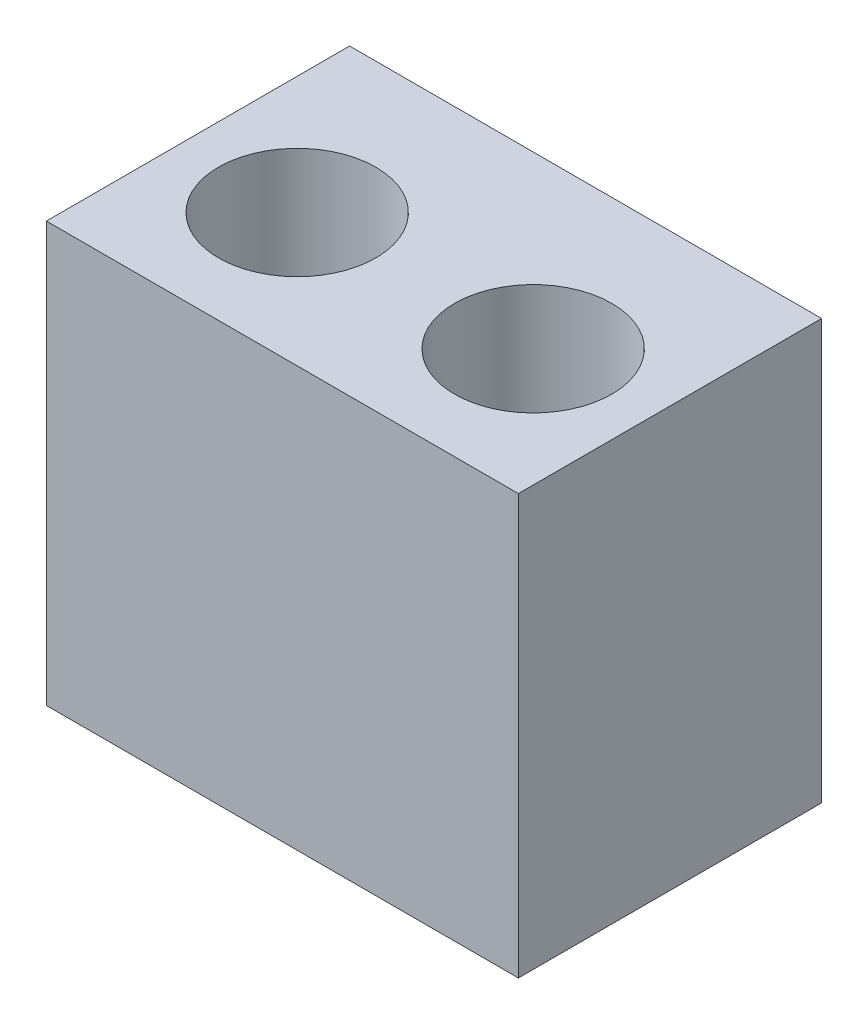
ISO-10303-21;
HEADER;
FILE_DESCRIPTION(('STEP AP214'),'2;1');
FILE_NAME('part.step','',(''),(''),'','','');
FILE_SCHEMA(('AUTOMOTIVE_DESIGN { 1 0 10303 214 1 1 1 1 }'));
ENDSEC;
DATA;
#1=APPLICATION_CONTEXT('core data for automotive mechanical design processes');
#2=APPLICATION_PROTOCOL_DEFINITION('international standard','automotive_design',2000,#1);
#3=PRODUCT_CONTEXT('',#1,'mechanical');
#4=PRODUCT('Part','Part','',(#3));
#5=PRODUCT_RELATED_PRODUCT_CATEGORY('part','',(#4));
#6=PRODUCT_DEFINITION_FORMATION('','',#4);
#7=PRODUCT_DEFINITION_CONTEXT('part definition',#1,'design');
#8=PRODUCT_DEFINITION('design','',#6,#7);
#9=PRODUCT_DEFINITION_SHAPE('','',#8);
#10=(LENGTH_UNIT() NAMED_UNIT(*) SI_UNIT(.MILLI.,.METRE.));
#11=(NAMED_UNIT(*) PLANE_ANGLE_UNIT() SI_UNIT($,.RADIAN.));
#12=(NAMED_UNIT(*) SI_UNIT($,.STERADIAN.) SOLID_ANGLE_UNIT());
#13=UNCERTAINTY_MEASURE_WITH_UNIT(LENGTH_MEASURE(1.E-05),#10,'distance_accuracy_value','');
#14=(GEOMETRIC_REPRESENTATION_CONTEXT(3) GLOBAL_UNCERTAINTY_ASSIGNED_CONTEXT((#13)) GLOBAL_UNIT_ASSIGNED_CONTEXT((#10,
#11,#12)) REPRESENTATION_CONTEXT('',''));
#15=CARTESIAN_POINT('',(0.,0.,0.));
#16=DIRECTION('',(0.,0.,1.));
#17=DIRECTION('',(1.,0.,0.));
#18=AXIS2_PLACEMENT_3D('',#15,#16,#17);
#19=CARTESIAN_POINT('',(181.884051224219,53.5885694032191,89.1179728939663));
#20=DIRECTION('',(-1.,0.,0.));
#21=DIRECTION('',(0.,0.,1.));
#22=AXIS2_PLACEMENT_3D('',#19,#20,#21);
#23=PLANE('',#22);
#24=DIRECTION('',(0.,1.,0.));
#25=VECTOR('',#24,1.);
#26=CARTESIAN_POINT('',(181.884051224219,53.5885694032192,28.9100000000052));
#27=LINE('',#26,#25);
#28=CARTESIAN_POINT('',(181.884051224219,13.5885694032191,28.9100000000051));
#29=VERTEX_POINT('',#28);
#30=CARTESIAN_POINT('',(181.884051224219,53.5885694032191,28.9100000000048));
#31=VERTEX_POINT('',#30);
#32=EDGE_CURVE('E89',#29,#31,#27,.T.);
#33=ORIENTED_EDGE('',*,*,#32,.F.);
#34=DIRECTION('',(0.,0.,-1.));
#35=VECTOR('',#34,1.);
#36=CARTESIAN_POINT('',(181.884051224219,13.5885694032191,89.1179728939663));
#37=LINE('',#36,#35);
#38=CARTESIAN_POINT('',(181.884051224219,13.5885694032191,0.));
#39=VERTEX_POINT('',#38);
#40=EDGE_CURVE('E43',#29,#39,#37,.T.);
#41=ORIENTED_EDGE('',*,*,#40,.T.);
#42=DIRECTION('',(0.,1.,0.));
#43=VECTOR('',#42,1.);
#44=CARTESIAN_POINT('',(181.884051224219,53.5885694032191,0.));
#45=LINE('',#44,#43);
#46=CARTESIAN_POINT('',(181.884051224219,53.5885694032191,0.));
#47=VERTEX_POINT('',#46);
#48=EDGE_CURVE('E87',#39,#47,#45,.T.);
#49=ORIENTED_EDGE('',*,*,#48,.T.);
#50=DIRECTION('',(0.,0.,-1.));
#51=VECTOR('',#50,1.);
#52=CARTESIAN_POINT('',(181.884051224219,53.5885694032191,89.1179728939663));
#53=LINE('',#52,#51);
#54=EDGE_CURVE('E78',#31,#47,#53,.T.);
#55=ORIENTED_EDGE('',*,*,#54,.F.);
#56=EDGE_LOOP('',(#33,#41,#49,#55));
#57=FACE_BOUND('',#56,.T.);
#58=ADVANCED_FACE('F39',(#57),#23,.F.);
#59=CARTESIAN_POINT('',(136.884051224219,53.5885694032191,89.1179728939663));
#60=DIRECTION('',(0.,-1.,0.));
#61=DIRECTION('',(0.,0.,-1.));
#62=AXIS2_PLACEMENT_3D('',#59,#60,#61);
#63=PLANE('',#62);
#64=CARTESIAN_POINT('',(148.134051224219,53.5885694032191,16.25));
#65=DIRECTION('',(0.,-1.,0.));
#66=DIRECTION('',(0.,0.,-1.));
#67=AXIS2_PLACEMENT_3D('',#64,#65,#66);
#68=CIRCLE('',#67,7.50000000000001);
#69=CARTESIAN_POINT('',(148.134051224219,53.5885694032191,8.74999999999999));
#70=VERTEX_POINT('',#69);
#71=EDGE_CURVE('E91',#70,#70,#68,.T.);
#72=ORIENTED_EDGE('',*,*,#71,.T.);
#73=EDGE_LOOP('',(#72));
#74=FACE_BOUND('',#73,.T.);
#75=CARTESIAN_POINT('',(170.634051224219,53.5885694032191,16.25));
#76=DIRECTION('',(0.,-1.,0.));
#77=DIRECTION('',(0.,0.,-1.));
#78=AXIS2_PLACEMENT_3D('',#75,#76,#77);
#79=CIRCLE('',#78,7.50000000000001);
#80=CARTESIAN_POINT('',(170.634051224219,53.5885694032191,8.74999999999999));
#81=VERTEX_POINT('',#80);
#82=EDGE_CURVE('E113',#81,#81,#79,.T.);
#83=ORIENTED_EDGE('',*,*,#82,.T.);
#84=EDGE_LOOP('',(#83));
#85=FACE_BOUND('',#84,.T.);
#86=DIRECTION('',(-1.,0.,0.));
#87=VECTOR('',#86,1.);
#88=CARTESIAN_POINT('',(136.88405122422,53.5885694032191,28.9100000000045));
#89=LINE('',#88,#87);
#90=CARTESIAN_POINT('',(136.884051224219,53.5885694032191,28.9100000000045));
#91=VERTEX_POINT('',#90);
#92=EDGE_CURVE('E48',#31,#91,#89,.T.);
#93=ORIENTED_EDGE('',*,*,#92,.F.);
#94=ORIENTED_EDGE('',*,*,#54,.T.);
#95=DIRECTION('',(-1.,0.,0.));
#96=VECTOR('',#95,1.);
#97=CARTESIAN_POINT('',(136.884051224219,53.5885694032191,0.));
#98=LINE('',#97,#96);
#99=CARTESIAN_POINT('',(136.884051224219,53.5885694032191,0.));
#100=VERTEX_POINT('',#99);
#101=EDGE_CURVE('E100',#47,#100,#98,.T.);
#102=ORIENTED_EDGE('',*,*,#101,.T.);
#103=DIRECTION('',(0.,0.,-1.));
#104=VECTOR('',#103,1.);
#105=CARTESIAN_POINT('',(136.884051224219,53.5885694032191,89.1179728939663));
#106=LINE('',#105,#104);
#107=EDGE_CURVE('E109',#91,#100,#106,.T.);
#108=ORIENTED_EDGE('',*,*,#107,.F.);
#109=EDGE_LOOP('',(#93,#94,#102,#108));
#110=FACE_BOUND('',#109,.T.);
#111=ADVANCED_FACE('F125',(#74,#85,#110),#63,.F.);
#112=CARTESIAN_POINT('',(136.884051224219,13.5885694032191,89.1179728939663));
#113=DIRECTION('',(1.,0.,0.));
#114=DIRECTION('',(0.,0.,-1.));
#115=AXIS2_PLACEMENT_3D('',#112,#113,#114);
#116=PLANE('',#115);
#117=DIRECTION('',(0.,-1.,0.));
#118=VECTOR('',#117,1.);
#119=CARTESIAN_POINT('',(136.884051224219,13.5885694032191,28.9100000000044));
#120=LINE('',#119,#118);
#121=CARTESIAN_POINT('',(136.884051224219,13.5885694032191,28.9100000000048));
#122=VERTEX_POINT('',#121);
#123=EDGE_CURVE('E11',#91,#122,#120,.T.);
#124=ORIENTED_EDGE('',*,*,#123,.F.);
#125=ORIENTED_EDGE('',*,*,#107,.T.);
#126=DIRECTION('',(0.,-1.,0.));
#127=VECTOR('',#126,1.);
#128=CARTESIAN_POINT('',(136.884051224219,13.5885694032191,0.));
#129=LINE('',#128,#127);
#130=CARTESIAN_POINT('',(136.884051224219,13.5885694032191,0.));
#131=VERTEX_POINT('',#130);
#132=EDGE_CURVE('E110',#100,#131,#129,.T.);
#133=ORIENTED_EDGE('',*,*,#132,.T.);
#134=DIRECTION('',(0.,0.,-1.));
#135=VECTOR('',#134,1.);
#136=CARTESIAN_POINT('',(136.884051224219,13.5885694032191,89.1179728939663));
#137=LINE('',#136,#135);
#138=EDGE_CURVE('E61',#122,#131,#137,.T.);
#139=ORIENTED_EDGE('',*,*,#138,.F.);
#140=EDGE_LOOP('',(#124,#125,#133,#139));
#141=FACE_BOUND('',#140,.T.);
#142=ADVANCED_FACE('F137',(#141),#116,.F.);
#143=CARTESIAN_POINT('',(181.884051224219,13.5885694032191,89.1179728939663));
#144=DIRECTION('',(0.,1.,0.));
#145=DIRECTION('',(-1.,0.,0.));
#146=AXIS2_PLACEMENT_3D('',#143,#144,#145);
#147=PLANE('',#146);
#148=CARTESIAN_POINT('',(148.134051224219,13.588569403219,16.25));
#149=DIRECTION('',(0.,-1.,0.));
#150=DIRECTION('',(0.,0.,-1.));
#151=AXIS2_PLACEMENT_3D('',#148,#149,#150);
#152=CIRCLE('',#151,7.50000000000001);
#153=CARTESIAN_POINT('',(148.134051224219,13.588569403219,8.74999999999999));
#154=VERTEX_POINT('',#153);
#155=EDGE_CURVE('E119',#154,#154,#152,.T.);
#156=ORIENTED_EDGE('',*,*,#155,.F.);
#157=EDGE_LOOP('',(#156));
#158=FACE_BOUND('',#157,.T.);
#159=CARTESIAN_POINT('',(170.634051224219,13.588569403219,16.25));
#160=DIRECTION('',(0.,-1.,0.));
#161=DIRECTION('',(0.,0.,-1.));
#162=AXIS2_PLACEMENT_3D('',#159,#160,#161);
#163=CIRCLE('',#162,7.50000000000001);
#164=CARTESIAN_POINT('',(170.634051224219,13.588569403219,8.74999999999999));
#165=VERTEX_POINT('',#164);
#166=EDGE_CURVE('E116',#165,#165,#163,.T.);
#167=ORIENTED_EDGE('',*,*,#166,.F.);
#168=EDGE_LOOP('',(#167));
#169=FACE_BOUND('',#168,.T.);
#170=DIRECTION('',(1.,0.,0.));
#171=VECTOR('',#170,1.);
#172=CARTESIAN_POINT('',(181.88405122422,13.5885694032191,28.9100000000051));
#173=LINE('',#172,#171);
#174=EDGE_CURVE('E97',#122,#29,#173,.T.);
#175=ORIENTED_EDGE('',*,*,#174,.F.);
#176=ORIENTED_EDGE('',*,*,#138,.T.);
#177=DIRECTION('',(1.,0.,0.));
#178=VECTOR('',#177,1.);
#179=CARTESIAN_POINT('',(181.884051224219,13.5885694032191,0.));
#180=LINE('',#179,#178);
#181=EDGE_CURVE('E93',#131,#39,#180,.T.);
#182=ORIENTED_EDGE('',*,*,#181,.T.);
#183=ORIENTED_EDGE('',*,*,#40,.F.);
#184=EDGE_LOOP('',(#175,#176,#182,#183));
#185=FACE_BOUND('',#184,.T.);
#186=ADVANCED_FACE('F94',(#158,#169,#185),#147,.F.);
#187=CARTESIAN_POINT('',(0.,0.,0.));
#188=DIRECTION('',(0.,0.,-1.));
#189=DIRECTION('',(-1.,0.,0.));
#190=AXIS2_PLACEMENT_3D('',#187,#188,#189);
#191=PLANE('',#190);
#192=ORIENTED_EDGE('',*,*,#48,.F.);
#193=ORIENTED_EDGE('',*,*,#181,.F.);
#194=ORIENTED_EDGE('',*,*,#132,.F.);
#195=ORIENTED_EDGE('',*,*,#101,.F.);
#196=EDGE_LOOP('',(#192,#193,#194,#195));
#197=FACE_BOUND('',#196,.T.);
#198=ADVANCED_FACE('F99',(#197),#191,.T.);
#199=CARTESIAN_POINT('',(181.884051224213,-170.839685458849,28.9100000000049));
#200=DIRECTION('',(0.,0.,1.));
#201=DIRECTION('',(0.,1.,0.));
#202=AXIS2_PLACEMENT_3D('',#199,#200,#201);
#203=PLANE('',#202);
#204=ORIENTED_EDGE('',*,*,#174,.T.);
#205=ORIENTED_EDGE('',*,*,#32,.T.);
#206=ORIENTED_EDGE('',*,*,#92,.T.);
#207=ORIENTED_EDGE('',*,*,#123,.T.);
#208=EDGE_LOOP('',(#204,#205,#206,#207));
#209=FACE_BOUND('',#208,.T.);
#210=ADVANCED_FACE('F41',(#209),#203,.T.);
#211=CARTESIAN_POINT('',(170.634051224219,53.5885694032191,16.25));
#212=DIRECTION('',(0.,-1.,0.));
#213=DIRECTION('',(0.,0.,-1.));
#214=AXIS2_PLACEMENT_3D('',#211,#212,#213);
#215=CYLINDRICAL_SURFACE('',#214,7.50000000000001);
#216=ORIENTED_EDGE('',*,*,#82,.F.);
#217=EDGE_LOOP('',(#216));
#218=FACE_BOUND('',#217,.T.);
#219=ORIENTED_EDGE('',*,*,#166,.T.);
#220=EDGE_LOOP('',(#219));
#221=FACE_BOUND('',#220,.T.);
#222=ADVANCED_FACE('F131',(#218,#221),#215,.F.);
#223=CARTESIAN_POINT('',(148.134051224219,53.5885694032191,16.25));
#224=DIRECTION('',(0.,-1.,0.));
#225=DIRECTION('',(0.,0.,-1.));
#226=AXIS2_PLACEMENT_3D('',#223,#224,#225);
#227=CYLINDRICAL_SURFACE('',#226,7.50000000000001);
#228=ORIENTED_EDGE('',*,*,#71,.F.);
#229=EDGE_LOOP('',(#228));
#230=FACE_BOUND('',#229,.T.);
#231=ORIENTED_EDGE('',*,*,#155,.T.);
#232=EDGE_LOOP('',(#231));
#233=FACE_BOUND('',#232,.T.);
#234=ADVANCED_FACE('F128',(#230,#233),#227,.F.);
#235=CLOSED_SHELL('',(#58,#111,#142,#186,#198,#210,#222,#234));
#236=MANIFOLD_SOLID_BREP('B2',#235);
#237=ADVANCED_BREP_SHAPE_REPRESENTATION('',(#18,#236),#14);
#238=SHAPE_DEFINITION_REPRESENTATION(#9,#237);
ENDSEC;
END-ISO-10303-21;
